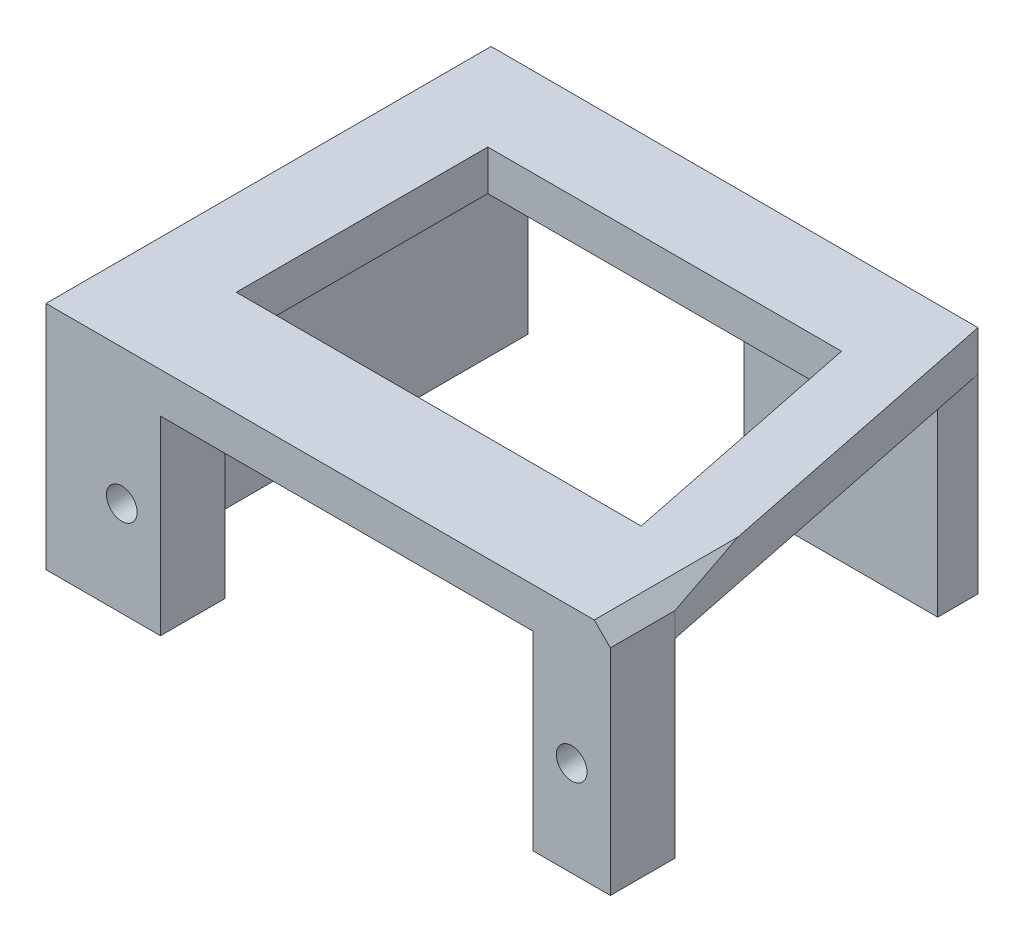
ISO-10303-21;
HEADER;
FILE_DESCRIPTION(('STEP AP214'),'2;1');
FILE_NAME('part.step','',(''),(''),'','','');
FILE_SCHEMA(('AUTOMOTIVE_DESIGN { 1 0 10303 214 1 1 1 1 }'));
ENDSEC;
DATA;
#1=APPLICATION_CONTEXT('core data for automotive mechanical design processes');
#2=APPLICATION_PROTOCOL_DEFINITION('international standard','automotive_design',2000,#1);
#3=PRODUCT_CONTEXT('',#1,'mechanical');
#4=PRODUCT('Part','Part','',(#3));
#5=PRODUCT_RELATED_PRODUCT_CATEGORY('part','',(#4));
#6=PRODUCT_DEFINITION_FORMATION('','',#4);
#7=PRODUCT_DEFINITION_CONTEXT('part definition',#1,'design');
#8=PRODUCT_DEFINITION('design','',#6,#7);
#9=PRODUCT_DEFINITION_SHAPE('','',#8);
#10=(LENGTH_UNIT() NAMED_UNIT(*) SI_UNIT(.MILLI.,.METRE.));
#11=(NAMED_UNIT(*) PLANE_ANGLE_UNIT() SI_UNIT($,.RADIAN.));
#12=(NAMED_UNIT(*) SI_UNIT($,.STERADIAN.) SOLID_ANGLE_UNIT());
#13=UNCERTAINTY_MEASURE_WITH_UNIT(LENGTH_MEASURE(1.E-05),#10,'distance_accuracy_value','');
#14=(GEOMETRIC_REPRESENTATION_CONTEXT(3) GLOBAL_UNCERTAINTY_ASSIGNED_CONTEXT((#13)) GLOBAL_UNIT_ASSIGNED_CONTEXT((#10,
#11,#12)) REPRESENTATION_CONTEXT('',''));
#15=CARTESIAN_POINT('',(0.,0.,0.));
#16=DIRECTION('',(0.,0.,1.));
#17=DIRECTION('',(1.,0.,0.));
#18=AXIS2_PLACEMENT_3D('',#15,#16,#17);
#19=CARTESIAN_POINT('',(0.,0.,0.));
#20=DIRECTION('',(0.,-1.,0.));
#21=DIRECTION('',(0.,0.,-1.));
#22=AXIS2_PLACEMENT_3D('',#19,#20,#21);
#23=PLANE('',#22);
#24=DIRECTION('',(-1.,0.,0.));
#25=VECTOR('',#24,1.);
#26=CARTESIAN_POINT('',(-12.2,0.,7.3));
#27=LINE('',#26,#25);
#28=CARTESIAN_POINT('',(12.9096289563416,0.,7.3));
#29=VERTEX_POINT('',#28);
#30=CARTESIAN_POINT('',(-12.2,0.,7.3));
#31=VERTEX_POINT('',#30);
#32=EDGE_CURVE('E193',#29,#31,#27,.T.);
#33=ORIENTED_EDGE('',*,*,#32,.F.);
#34=DIRECTION('',(0.199309151648976,0.,0.979936662274132));
#35=VECTOR('',#34,1.);
#36=CARTESIAN_POINT('',(12.9096289563416,0.,7.3));
#37=LINE('',#36,#35);
#38=CARTESIAN_POINT('',(9.73674760040939,0.,-8.30000000000001));
#39=VERTEX_POINT('',#38);
#40=EDGE_CURVE('E197',#39,#29,#37,.T.);
#41=ORIENTED_EDGE('',*,*,#40,.F.);
#42=DIRECTION('',(1.,0.,0.));
#43=VECTOR('',#42,1.);
#44=CARTESIAN_POINT('',(9.73674760040939,0.,-8.30000000000001));
#45=LINE('',#44,#43);
#46=CARTESIAN_POINT('',(-12.2,0.,-8.30000000000001));
#47=VERTEX_POINT('',#46);
#48=EDGE_CURVE('E177',#47,#39,#45,.T.);
#49=ORIENTED_EDGE('',*,*,#48,.F.);
#50=DIRECTION('',(0.,0.,-1.));
#51=VECTOR('',#50,1.);
#52=CARTESIAN_POINT('',(-12.2,0.,-8.30000000000001));
#53=LINE('',#52,#51);
#54=EDGE_CURVE('E188',#31,#47,#53,.T.);
#55=ORIENTED_EDGE('',*,*,#54,.F.);
#56=EDGE_LOOP('',(#33,#41,#49,#55));
#57=FACE_BOUND('',#56,.T.);
#58=DIRECTION('',(-0.199309151648976,0.,-0.979936662274132));
#59=VECTOR('',#58,1.);
#60=CARTESIAN_POINT('',(12.7,0.,-13.8));
#61=LINE('',#60,#59);
#62=CARTESIAN_POINT('',(17.5,0.,9.8));
#63=VERTEX_POINT('',#62);
#64=CARTESIAN_POINT('',(12.7,0.,-13.8));
#65=VERTEX_POINT('',#64);
#66=EDGE_CURVE('E204',#63,#65,#61,.T.);
#67=ORIENTED_EDGE('',*,*,#66,.F.);
#68=DIRECTION('',(1.,0.,0.));
#69=VECTOR('',#68,1.);
#70=CARTESIAN_POINT('',(12.7,0.,9.8));
#71=LINE('',#70,#69);
#72=CARTESIAN_POINT('',(12.7,0.,9.8));
#73=VERTEX_POINT('',#72);
#74=EDGE_CURVE('E265',#73,#63,#71,.T.);
#75=ORIENTED_EDGE('',*,*,#74,.F.);
#76=DIRECTION('',(0.,0.,-1.));
#77=VECTOR('',#76,1.);
#78=CARTESIAN_POINT('',(12.7,0.,9.8));
#79=LINE('',#78,#77);
#80=CARTESIAN_POINT('',(12.7,0.,13.8));
#81=VERTEX_POINT('',#80);
#82=EDGE_CURVE('E260',#81,#73,#79,.T.);
#83=ORIENTED_EDGE('',*,*,#82,.F.);
#84=DIRECTION('',(1.,0.,0.));
#85=VECTOR('',#84,1.);
#86=CARTESIAN_POINT('',(-17.5,0.,13.8));
#87=LINE('',#86,#85);
#88=CARTESIAN_POINT('',(-10.4,0.,13.8));
#89=VERTEX_POINT('',#88);
#90=EDGE_CURVE('E317',#89,#81,#87,.T.);
#91=ORIENTED_EDGE('',*,*,#90,.F.);
#92=DIRECTION('',(0.,0.,1.));
#93=VECTOR('',#92,1.);
#94=CARTESIAN_POINT('',(-10.4,0.,13.8));
#95=LINE('',#94,#93);
#96=CARTESIAN_POINT('',(-10.4,0.,9.8));
#97=VERTEX_POINT('',#96);
#98=EDGE_CURVE('E233',#97,#89,#95,.T.);
#99=ORIENTED_EDGE('',*,*,#98,.F.);
#100=DIRECTION('',(1.,0.,0.));
#101=VECTOR('',#100,1.);
#102=CARTESIAN_POINT('',(-15.2,0.,9.8));
#103=LINE('',#102,#101);
#104=CARTESIAN_POINT('',(-15.2,0.,9.8));
#105=VERTEX_POINT('',#104);
#106=EDGE_CURVE('E247',#105,#97,#103,.T.);
#107=ORIENTED_EDGE('',*,*,#106,.F.);
#108=DIRECTION('',(0.,0.,1.));
#109=VECTOR('',#108,1.);
#110=CARTESIAN_POINT('',(-15.2,0.,9.8));
#111=LINE('',#110,#109);
#112=CARTESIAN_POINT('',(-15.2,0.,-13.8));
#113=VERTEX_POINT('',#112);
#114=EDGE_CURVE('E245',#113,#105,#111,.T.);
#115=ORIENTED_EDGE('',*,*,#114,.F.);
#116=DIRECTION('',(-1.,0.,0.));
#117=VECTOR('',#116,1.);
#118=CARTESIAN_POINT('',(-17.5,0.,-13.8));
#119=LINE('',#118,#117);
#120=CARTESIAN_POINT('',(0.700000000000003,0.,-13.8));
#121=VERTEX_POINT('',#120);
#122=EDGE_CURVE('E313',#121,#113,#119,.T.);
#123=ORIENTED_EDGE('',*,*,#122,.F.);
#124=DIRECTION('',(0.,0.,-1.));
#125=VECTOR('',#124,1.);
#126=CARTESIAN_POINT('',(0.700000000000003,0.,-11.3));
#127=LINE('',#126,#125);
#128=CARTESIAN_POINT('',(0.700000000000003,0.,-11.3));
#129=VERTEX_POINT('',#128);
#130=EDGE_CURVE('E288',#129,#121,#127,.T.);
#131=ORIENTED_EDGE('',*,*,#130,.F.);
#132=DIRECTION('',(-1.,0.,0.));
#133=VECTOR('',#132,1.);
#134=CARTESIAN_POINT('',(0.700000000000003,0.,-11.3));
#135=LINE('',#134,#133);
#136=CARTESIAN_POINT('',(12.7,0.,-11.3));
#137=VERTEX_POINT('',#136);
#138=EDGE_CURVE('E297',#137,#129,#135,.T.);
#139=ORIENTED_EDGE('',*,*,#138,.F.);
#140=DIRECTION('',(0.,0.,1.));
#141=VECTOR('',#140,1.);
#142=CARTESIAN_POINT('',(12.7,0.,-11.3));
#143=LINE('',#142,#141);
#144=EDGE_CURVE('E283',#65,#137,#143,.T.);
#145=ORIENTED_EDGE('',*,*,#144,.F.);
#146=EDGE_LOOP('',(#67,#75,#83,#91,#99,#107,#115,#123,#131,#139,#145));
#147=FACE_BOUND('',#146,.T.);
#148=ADVANCED_FACE('F37',(#57,#147),#23,.T.);
#149=CARTESIAN_POINT('',(17.5,2.5,13.8));
#150=DIRECTION('',(-1.,0.,0.));
#151=DIRECTION('',(0.,0.,1.));
#152=AXIS2_PLACEMENT_3D('',#149,#150,#151);
#153=PLANE('',#152);
#154=DIRECTION('',(0.,-1.,0.));
#155=VECTOR('',#154,1.);
#156=CARTESIAN_POINT('',(17.5,10.,9.8));
#157=LINE('',#156,#155);
#158=CARTESIAN_POINT('',(17.5,1.49999999999999,9.8));
#159=VERTEX_POINT('',#158);
#160=EDGE_CURVE('E208',#159,#63,#157,.T.);
#161=ORIENTED_EDGE('',*,*,#160,.F.);
#162=DIRECTION('',(0.,0.,1.));
#163=VECTOR('',#162,1.);
#164=CARTESIAN_POINT('',(17.5,1.49999999999999,13.8));
#165=LINE('',#164,#163);
#166=CARTESIAN_POINT('',(17.5,1.49999999999999,13.8));
#167=VERTEX_POINT('',#166);
#168=EDGE_CURVE('E45',#159,#167,#165,.T.);
#169=ORIENTED_EDGE('',*,*,#168,.T.);
#170=DIRECTION('',(0.,-1.,0.));
#171=VECTOR('',#170,1.);
#172=CARTESIAN_POINT('',(17.5,2.5,13.8));
#173=LINE('',#172,#171);
#174=CARTESIAN_POINT('',(17.5,-11.8,13.8));
#175=VERTEX_POINT('',#174);
#176=EDGE_CURVE('E322',#167,#175,#173,.T.);
#177=ORIENTED_EDGE('',*,*,#176,.T.);
#178=DIRECTION('',(0.,0.,1.));
#179=VECTOR('',#178,1.);
#180=CARTESIAN_POINT('',(17.5,-11.8,9.8));
#181=LINE('',#180,#179);
#182=CARTESIAN_POINT('',(17.5,-11.8,9.8));
#183=VERTEX_POINT('',#182);
#184=EDGE_CURVE('E261',#183,#175,#181,.T.);
#185=ORIENTED_EDGE('',*,*,#184,.F.);
#186=DIRECTION('',(0.,1.,0.));
#187=VECTOR('',#186,1.);
#188=CARTESIAN_POINT('',(17.5,-11.8,9.8));
#189=LINE('',#188,#187);
#190=EDGE_CURVE('E271',#183,#63,#189,.T.);
#191=ORIENTED_EDGE('',*,*,#190,.T.);
#192=EDGE_LOOP('',(#161,#169,#177,#185,#191));
#193=FACE_BOUND('',#192,.T.);
#194=ADVANCED_FACE('F378',(#193),#153,.F.);
#195=CARTESIAN_POINT('',(-17.5,2.5,-13.8));
#196=DIRECTION('',(0.,0.,1.));
#197=DIRECTION('',(1.,0.,0.));
#198=AXIS2_PLACEMENT_3D('',#195,#196,#197);
#199=PLANE('',#198);
#200=CARTESIAN_POINT('',(6.7,-6.,-13.8));
#201=DIRECTION('',(0.,0.,-1.));
#202=DIRECTION('',(-1.,0.,0.));
#203=AXIS2_PLACEMENT_3D('',#200,#201,#202);
#204=CIRCLE('',#203,0.95);
#205=CARTESIAN_POINT('',(5.75,-6.,-13.8));
#206=VERTEX_POINT('',#205);
#207=EDGE_CURVE('E225',#206,#206,#204,.T.);
#208=ORIENTED_EDGE('',*,*,#207,.F.);
#209=EDGE_LOOP('',(#208));
#210=FACE_BOUND('',#209,.T.);
#211=DIRECTION('',(-1.,0.,0.));
#212=VECTOR('',#211,1.);
#213=CARTESIAN_POINT('',(-17.5,2.5,-13.8));
#214=LINE('',#213,#212);
#215=CARTESIAN_POINT('',(12.7,2.5,-13.8));
#216=VERTEX_POINT('',#215);
#217=CARTESIAN_POINT('',(-17.5,2.5,-13.8));
#218=VERTEX_POINT('',#217);
#219=EDGE_CURVE('E314',#216,#218,#214,.T.);
#220=ORIENTED_EDGE('',*,*,#219,.F.);
#221=DIRECTION('',(0.,-1.,0.));
#222=VECTOR('',#221,1.);
#223=CARTESIAN_POINT('',(12.7,10.,-13.8));
#224=LINE('',#223,#222);
#225=EDGE_CURVE('E209',#216,#65,#224,.T.);
#226=ORIENTED_EDGE('',*,*,#225,.T.);
#227=DIRECTION('',(0.,1.,0.));
#228=VECTOR('',#227,1.);
#229=CARTESIAN_POINT('',(12.7,-11.8,-13.8));
#230=LINE('',#229,#228);
#231=CARTESIAN_POINT('',(12.7,-11.8,-13.8));
#232=VERTEX_POINT('',#231);
#233=EDGE_CURVE('E294',#232,#65,#230,.T.);
#234=ORIENTED_EDGE('',*,*,#233,.F.);
#235=DIRECTION('',(1.,0.,0.));
#236=VECTOR('',#235,1.);
#237=CARTESIAN_POINT('',(0.700000000000003,-11.8,-13.8));
#238=LINE('',#237,#236);
#239=CARTESIAN_POINT('',(0.700000000000003,-11.8,-13.8));
#240=VERTEX_POINT('',#239);
#241=EDGE_CURVE('E292',#240,#232,#238,.T.);
#242=ORIENTED_EDGE('',*,*,#241,.F.);
#243=DIRECTION('',(0.,1.,0.));
#244=VECTOR('',#243,1.);
#245=CARTESIAN_POINT('',(0.700000000000003,-11.8,-13.8));
#246=LINE('',#245,#244);
#247=EDGE_CURVE('E304',#240,#121,#246,.T.);
#248=ORIENTED_EDGE('',*,*,#247,.T.);
#249=ORIENTED_EDGE('',*,*,#122,.T.);
#250=DIRECTION('',(0.,1.,0.));
#251=VECTOR('',#250,1.);
#252=CARTESIAN_POINT('',(-15.2,-11.8,-13.8));
#253=LINE('',#252,#251);
#254=CARTESIAN_POINT('',(-15.2,-11.8,-13.8));
#255=VERTEX_POINT('',#254);
#256=EDGE_CURVE('E258',#255,#113,#253,.T.);
#257=ORIENTED_EDGE('',*,*,#256,.F.);
#258=DIRECTION('',(1.,0.,0.));
#259=VECTOR('',#258,1.);
#260=CARTESIAN_POINT('',(-17.5,-11.8,-13.8));
#261=LINE('',#260,#259);
#262=CARTESIAN_POINT('',(-17.5,-11.8,-13.8));
#263=VERTEX_POINT('',#262);
#264=EDGE_CURVE('E232',#263,#255,#261,.T.);
#265=ORIENTED_EDGE('',*,*,#264,.F.);
#266=DIRECTION('',(0.,-1.,0.));
#267=VECTOR('',#266,1.);
#268=CARTESIAN_POINT('',(-17.5,2.5,-13.8));
#269=LINE('',#268,#267);
#270=EDGE_CURVE('E329',#218,#263,#269,.T.);
#271=ORIENTED_EDGE('',*,*,#270,.F.);
#272=EDGE_LOOP('',(#220,#226,#234,#242,#248,#249,#257,#265,#271));
#273=FACE_BOUND('',#272,.T.);
#274=ADVANCED_FACE('F361',(#210,#273),#199,.F.);
#275=CARTESIAN_POINT('',(-17.5,2.5,13.8));
#276=DIRECTION('',(1.,0.,0.));
#277=DIRECTION('',(0.,0.,-1.));
#278=AXIS2_PLACEMENT_3D('',#275,#276,#277);
#279=PLANE('',#278);
#280=ORIENTED_EDGE('',*,*,#270,.T.);
#281=DIRECTION('',(0.,0.,-1.));
#282=VECTOR('',#281,1.);
#283=CARTESIAN_POINT('',(-17.5,-11.8,13.8));
#284=LINE('',#283,#282);
#285=CARTESIAN_POINT('',(-17.5,-11.8,13.8));
#286=VERTEX_POINT('',#285);
#287=EDGE_CURVE('E229',#286,#263,#284,.T.);
#288=ORIENTED_EDGE('',*,*,#287,.F.);
#289=DIRECTION('',(0.,-1.,0.));
#290=VECTOR('',#289,1.);
#291=CARTESIAN_POINT('',(-17.5,2.5,13.8));
#292=LINE('',#291,#290);
#293=CARTESIAN_POINT('',(-17.5,2.5,13.8));
#294=VERTEX_POINT('',#293);
#295=EDGE_CURVE('E327',#294,#286,#292,.T.);
#296=ORIENTED_EDGE('',*,*,#295,.F.);
#297=DIRECTION('',(0.,0.,1.));
#298=VECTOR('',#297,1.);
#299=CARTESIAN_POINT('',(-17.5,2.5,13.8));
#300=LINE('',#299,#298);
#301=EDGE_CURVE('E316',#218,#294,#300,.T.);
#302=ORIENTED_EDGE('',*,*,#301,.F.);
#303=EDGE_LOOP('',(#280,#288,#296,#302));
#304=FACE_BOUND('',#303,.T.);
#305=ADVANCED_FACE('F367',(#304),#279,.F.);
#306=CARTESIAN_POINT('',(-17.5,2.5,13.8));
#307=DIRECTION('',(0.,0.,-1.));
#308=DIRECTION('',(-1.,0.,0.));
#309=AXIS2_PLACEMENT_3D('',#306,#307,#308);
#310=PLANE('',#309);
#311=CARTESIAN_POINT('',(15.1,-5.9,13.8));
#312=DIRECTION('',(0.,0.,-1.));
#313=DIRECTION('',(-1.,0.,0.));
#314=AXIS2_PLACEMENT_3D('',#311,#312,#313);
#315=CIRCLE('',#314,0.949999999999999);
#316=CARTESIAN_POINT('',(14.15,-5.9,13.8));
#317=VERTEX_POINT('',#316);
#318=EDGE_CURVE('E222',#317,#317,#315,.T.);
#319=ORIENTED_EDGE('',*,*,#318,.T.);
#320=EDGE_LOOP('',(#319));
#321=FACE_BOUND('',#320,.T.);
#322=CARTESIAN_POINT('',(-12.8,-5.9,13.8));
#323=DIRECTION('',(0.,0.,-1.));
#324=DIRECTION('',(-1.,0.,0.));
#325=AXIS2_PLACEMENT_3D('',#322,#323,#324);
#326=CIRCLE('',#325,0.949999999999999);
#327=CARTESIAN_POINT('',(-13.75,-5.9,13.8));
#328=VERTEX_POINT('',#327);
#329=EDGE_CURVE('E217',#328,#328,#326,.T.);
#330=ORIENTED_EDGE('',*,*,#329,.T.);
#331=EDGE_LOOP('',(#330));
#332=FACE_BOUND('',#331,.T.);
#333=ORIENTED_EDGE('',*,*,#176,.F.);
#334=DIRECTION('',(0.707106781186545,-0.70710678118655,0.));
#335=VECTOR('',#334,1.);
#336=CARTESIAN_POINT('',(16.5,2.5,13.8));
#337=LINE('',#336,#335);
#338=CARTESIAN_POINT('',(16.5,2.5,13.8));
#339=VERTEX_POINT('',#338);
#340=EDGE_CURVE('E11',#167,#339,#337,.F.);
#341=ORIENTED_EDGE('',*,*,#340,.T.);
#342=DIRECTION('',(1.,0.,0.));
#343=VECTOR('',#342,1.);
#344=CARTESIAN_POINT('',(-17.5,2.5,13.8));
#345=LINE('',#344,#343);
#346=EDGE_CURVE('E319',#294,#339,#345,.T.);
#347=ORIENTED_EDGE('',*,*,#346,.F.);
#348=ORIENTED_EDGE('',*,*,#295,.T.);
#349=DIRECTION('',(-1.,0.,0.));
#350=VECTOR('',#349,1.);
#351=CARTESIAN_POINT('',(-15.2,-11.8,13.8));
#352=LINE('',#351,#350);
#353=CARTESIAN_POINT('',(-10.4,-11.8,13.8));
#354=VERTEX_POINT('',#353);
#355=EDGE_CURVE('E241',#354,#286,#352,.T.);
#356=ORIENTED_EDGE('',*,*,#355,.F.);
#357=DIRECTION('',(0.,1.,0.));
#358=VECTOR('',#357,1.);
#359=CARTESIAN_POINT('',(-10.4,-11.8,13.8));
#360=LINE('',#359,#358);
#361=EDGE_CURVE('E244',#354,#89,#360,.T.);
#362=ORIENTED_EDGE('',*,*,#361,.T.);
#363=ORIENTED_EDGE('',*,*,#90,.T.);
#364=DIRECTION('',(0.,1.,0.));
#365=VECTOR('',#364,1.);
#366=CARTESIAN_POINT('',(12.7,-11.8,13.8));
#367=LINE('',#366,#365);
#368=CARTESIAN_POINT('',(12.7,-11.8,13.8));
#369=VERTEX_POINT('',#368);
#370=EDGE_CURVE('E280',#369,#81,#367,.T.);
#371=ORIENTED_EDGE('',*,*,#370,.F.);
#372=DIRECTION('',(-1.,0.,0.));
#373=VECTOR('',#372,1.);
#374=CARTESIAN_POINT('',(12.7,-11.8,13.8));
#375=LINE('',#374,#373);
#376=EDGE_CURVE('E264',#175,#369,#375,.T.);
#377=ORIENTED_EDGE('',*,*,#376,.F.);
#378=EDGE_LOOP('',(#333,#341,#347,#348,#356,#362,#363,#371,#377));
#379=FACE_BOUND('',#378,.T.);
#380=ADVANCED_FACE('F370',(#321,#332,#379),#310,.F.);
#381=CARTESIAN_POINT('',(0.,2.5,0.));
#382=DIRECTION('',(0.,-1.,0.));
#383=DIRECTION('',(0.,0.,-1.));
#384=AXIS2_PLACEMENT_3D('',#381,#382,#383);
#385=PLANE('',#384);
#386=DIRECTION('',(0.199309151648976,0.,0.979936662274132));
#387=VECTOR('',#386,1.);
#388=CARTESIAN_POINT('',(10.9710395578,2.5,-2.23139787616271));
#389=LINE('',#388,#387);
#390=CARTESIAN_POINT('',(9.73674760040939,2.5,-8.30000000000001));
#391=VERTEX_POINT('',#390);
#392=CARTESIAN_POINT('',(12.9096289563416,2.5,7.3));
#393=VERTEX_POINT('',#392);
#394=EDGE_CURVE('E338',#391,#393,#389,.T.);
#395=ORIENTED_EDGE('',*,*,#394,.T.);
#396=DIRECTION('',(-1.,0.,0.));
#397=VECTOR('',#396,1.);
#398=CARTESIAN_POINT('',(0.,2.5,7.3));
#399=LINE('',#398,#397);
#400=CARTESIAN_POINT('',(-12.2,2.5,7.3));
#401=VERTEX_POINT('',#400);
#402=EDGE_CURVE('E341',#393,#401,#399,.T.);
#403=ORIENTED_EDGE('',*,*,#402,.T.);
#404=DIRECTION('',(0.,0.,-1.));
#405=VECTOR('',#404,1.);
#406=CARTESIAN_POINT('',(-12.2,2.5,0.));
#407=LINE('',#406,#405);
#408=CARTESIAN_POINT('',(-12.2,2.5,-8.30000000000001));
#409=VERTEX_POINT('',#408);
#410=EDGE_CURVE('E335',#401,#409,#407,.T.);
#411=ORIENTED_EDGE('',*,*,#410,.T.);
#412=DIRECTION('',(1.,0.,0.));
#413=VECTOR('',#412,1.);
#414=CARTESIAN_POINT('',(0.,2.5,-8.30000000000001));
#415=LINE('',#414,#413);
#416=EDGE_CURVE('E180',#409,#391,#415,.T.);
#417=ORIENTED_EDGE('',*,*,#416,.T.);
#418=EDGE_LOOP('',(#395,#403,#411,#417));
#419=FACE_BOUND('',#418,.T.);
#420=ORIENTED_EDGE('',*,*,#346,.T.);
#421=DIRECTION('',(0.,0.,-1.));
#422=VECTOR('',#421,1.);
#423=CARTESIAN_POINT('',(16.5,2.5,0.));
#424=LINE('',#423,#422);
#425=CARTESIAN_POINT('',(16.5,2.5,4.88333333333329));
#426=VERTEX_POINT('',#425);
#427=EDGE_CURVE('E344',#339,#426,#424,.T.);
#428=ORIENTED_EDGE('',*,*,#427,.T.);
#429=DIRECTION('',(-0.199309151648976,0.,-0.979936662274132));
#430=VECTOR('',#429,1.);
#431=CARTESIAN_POINT('',(14.8907862068966,2.5,-3.02863448275862));
#432=LINE('',#431,#430);
#433=EDGE_CURVE('E331',#426,#216,#432,.T.);
#434=ORIENTED_EDGE('',*,*,#433,.T.);
#435=ORIENTED_EDGE('',*,*,#219,.T.);
#436=ORIENTED_EDGE('',*,*,#301,.T.);
#437=EDGE_LOOP('',(#420,#428,#434,#435,#436));
#438=FACE_BOUND('',#437,.T.);
#439=ADVANCED_FACE('F349',(#419,#438),#385,.F.);
#440=CARTESIAN_POINT('',(12.7,-11.8,-11.3));
#441=DIRECTION('',(-1.,0.,0.));
#442=DIRECTION('',(0.,0.,1.));
#443=AXIS2_PLACEMENT_3D('',#440,#441,#442);
#444=PLANE('',#443);
#445=ORIENTED_EDGE('',*,*,#144,.T.);
#446=DIRECTION('',(0.,1.,0.));
#447=VECTOR('',#446,1.);
#448=CARTESIAN_POINT('',(12.7,-11.8,-11.3));
#449=LINE('',#448,#447);
#450=CARTESIAN_POINT('',(12.7,-11.8,-11.3));
#451=VERTEX_POINT('',#450);
#452=EDGE_CURVE('E310',#451,#137,#449,.T.);
#453=ORIENTED_EDGE('',*,*,#452,.F.);
#454=DIRECTION('',(0.,0.,1.));
#455=VECTOR('',#454,1.);
#456=CARTESIAN_POINT('',(12.7,-11.8,-11.3));
#457=LINE('',#456,#455);
#458=EDGE_CURVE('E284',#232,#451,#457,.T.);
#459=ORIENTED_EDGE('',*,*,#458,.F.);
#460=ORIENTED_EDGE('',*,*,#233,.T.);
#461=EDGE_LOOP('',(#445,#453,#459,#460));
#462=FACE_BOUND('',#461,.T.);
#463=ADVANCED_FACE('F409',(#462),#444,.F.);
#464=CARTESIAN_POINT('',(0.700000000000003,-11.8,-11.3));
#465=DIRECTION('',(0.,0.,-1.));
#466=DIRECTION('',(-1.,0.,0.));
#467=AXIS2_PLACEMENT_3D('',#464,#465,#466);
#468=PLANE('',#467);
#469=CARTESIAN_POINT('',(6.7,-6.,-11.3));
#470=DIRECTION('',(0.,0.,-1.));
#471=DIRECTION('',(-1.,0.,0.));
#472=AXIS2_PLACEMENT_3D('',#469,#470,#471);
#473=CIRCLE('',#472,0.95);
#474=CARTESIAN_POINT('',(5.75,-6.,-11.3));
#475=VERTEX_POINT('',#474);
#476=EDGE_CURVE('E228',#475,#475,#473,.T.);
#477=ORIENTED_EDGE('',*,*,#476,.T.);
#478=EDGE_LOOP('',(#477));
#479=FACE_BOUND('',#478,.T.);
#480=ORIENTED_EDGE('',*,*,#138,.T.);
#481=DIRECTION('',(0.,1.,0.));
#482=VECTOR('',#481,1.);
#483=CARTESIAN_POINT('',(0.700000000000003,-11.8,-11.3));
#484=LINE('',#483,#482);
#485=CARTESIAN_POINT('',(0.700000000000003,-11.8,-11.3));
#486=VERTEX_POINT('',#485);
#487=EDGE_CURVE('E307',#486,#129,#484,.T.);
#488=ORIENTED_EDGE('',*,*,#487,.F.);
#489=DIRECTION('',(-1.,0.,0.));
#490=VECTOR('',#489,1.);
#491=CARTESIAN_POINT('',(0.700000000000003,-11.8,-11.3));
#492=LINE('',#491,#490);
#493=EDGE_CURVE('E287',#451,#486,#492,.T.);
#494=ORIENTED_EDGE('',*,*,#493,.F.);
#495=ORIENTED_EDGE('',*,*,#452,.T.);
#496=EDGE_LOOP('',(#480,#488,#494,#495));
#497=FACE_BOUND('',#496,.T.);
#498=ADVANCED_FACE('F405',(#479,#497),#468,.F.);
#499=CARTESIAN_POINT('',(0.700000000000003,-11.8,-11.3));
#500=DIRECTION('',(1.,0.,0.));
#501=DIRECTION('',(0.,0.,-1.));
#502=AXIS2_PLACEMENT_3D('',#499,#500,#501);
#503=PLANE('',#502);
#504=ORIENTED_EDGE('',*,*,#130,.T.);
#505=ORIENTED_EDGE('',*,*,#247,.F.);
#506=DIRECTION('',(0.,0.,-1.));
#507=VECTOR('',#506,1.);
#508=CARTESIAN_POINT('',(0.700000000000003,-11.8,-11.3));
#509=LINE('',#508,#507);
#510=EDGE_CURVE('E290',#486,#240,#509,.T.);
#511=ORIENTED_EDGE('',*,*,#510,.F.);
#512=ORIENTED_EDGE('',*,*,#487,.T.);
#513=EDGE_LOOP('',(#504,#505,#511,#512));
#514=FACE_BOUND('',#513,.T.);
#515=ADVANCED_FACE('F408',(#514),#503,.F.);
#516=CARTESIAN_POINT('',(0.,-11.8,0.));
#517=DIRECTION('',(0.,-1.,0.));
#518=DIRECTION('',(0.,0.,-1.));
#519=AXIS2_PLACEMENT_3D('',#516,#517,#518);
#520=PLANE('',#519);
#521=ORIENTED_EDGE('',*,*,#458,.T.);
#522=ORIENTED_EDGE('',*,*,#493,.T.);
#523=ORIENTED_EDGE('',*,*,#510,.T.);
#524=ORIENTED_EDGE('',*,*,#241,.T.);
#525=EDGE_LOOP('',(#521,#522,#523,#524));
#526=FACE_BOUND('',#525,.T.);
#527=ADVANCED_FACE('F418',(#526),#520,.T.);
#528=CARTESIAN_POINT('',(12.7,-11.8,9.8));
#529=DIRECTION('',(1.,0.,0.));
#530=DIRECTION('',(0.,0.,-1.));
#531=AXIS2_PLACEMENT_3D('',#528,#529,#530);
#532=PLANE('',#531);
#533=ORIENTED_EDGE('',*,*,#82,.T.);
#534=DIRECTION('',(0.,1.,0.));
#535=VECTOR('',#534,1.);
#536=CARTESIAN_POINT('',(12.7,-11.8,9.8));
#537=LINE('',#536,#535);
#538=CARTESIAN_POINT('',(12.7,-11.8,9.8));
#539=VERTEX_POINT('',#538);
#540=EDGE_CURVE('E278',#539,#73,#537,.T.);
#541=ORIENTED_EDGE('',*,*,#540,.F.);
#542=DIRECTION('',(0.,0.,-1.));
#543=VECTOR('',#542,1.);
#544=CARTESIAN_POINT('',(12.7,-11.8,9.8));
#545=LINE('',#544,#543);
#546=EDGE_CURVE('E267',#369,#539,#545,.T.);
#547=ORIENTED_EDGE('',*,*,#546,.F.);
#548=ORIENTED_EDGE('',*,*,#370,.T.);
#549=EDGE_LOOP('',(#533,#541,#547,#548));
#550=FACE_BOUND('',#549,.T.);
#551=ADVANCED_FACE('F434',(#550),#532,.F.);
#552=CARTESIAN_POINT('',(12.7,-11.8,9.8));
#553=DIRECTION('',(0.,0.,1.));
#554=DIRECTION('',(1.,0.,0.));
#555=AXIS2_PLACEMENT_3D('',#552,#553,#554);
#556=PLANE('',#555);
#557=CARTESIAN_POINT('',(15.1,-5.9,9.8));
#558=DIRECTION('',(0.,0.,-1.));
#559=DIRECTION('',(-1.,0.,0.));
#560=AXIS2_PLACEMENT_3D('',#557,#558,#559);
#561=CIRCLE('',#560,0.949999999999999);
#562=CARTESIAN_POINT('',(14.15,-5.9,9.8));
#563=VERTEX_POINT('',#562);
#564=EDGE_CURVE('E214',#563,#563,#561,.T.);
#565=ORIENTED_EDGE('',*,*,#564,.F.);
#566=EDGE_LOOP('',(#565));
#567=FACE_BOUND('',#566,.T.);
#568=ORIENTED_EDGE('',*,*,#74,.T.);
#569=ORIENTED_EDGE('',*,*,#190,.F.);
#570=DIRECTION('',(1.,0.,0.));
#571=VECTOR('',#570,1.);
#572=CARTESIAN_POINT('',(12.7,-11.8,9.8));
#573=LINE('',#572,#571);
#574=EDGE_CURVE('E269',#539,#183,#573,.T.);
#575=ORIENTED_EDGE('',*,*,#574,.F.);
#576=ORIENTED_EDGE('',*,*,#540,.T.);
#577=EDGE_LOOP('',(#568,#569,#575,#576));
#578=FACE_BOUND('',#577,.T.);
#579=ADVANCED_FACE('F425',(#567,#578),#556,.F.);
#580=CARTESIAN_POINT('',(0.,-11.8,0.));
#581=DIRECTION('',(0.,1.,0.));
#582=DIRECTION('',(0.,0.,1.));
#583=AXIS2_PLACEMENT_3D('',#580,#581,#582);
#584=PLANE('',#583);
#585=ORIENTED_EDGE('',*,*,#184,.T.);
#586=ORIENTED_EDGE('',*,*,#376,.T.);
#587=ORIENTED_EDGE('',*,*,#546,.T.);
#588=ORIENTED_EDGE('',*,*,#574,.T.);
#589=EDGE_LOOP('',(#585,#586,#587,#588));
#590=FACE_BOUND('',#589,.T.);
#591=ADVANCED_FACE('F430',(#590),#584,.F.);
#592=CARTESIAN_POINT('',(-15.2,-11.8,9.8));
#593=DIRECTION('',(-1.,0.,0.));
#594=DIRECTION('',(0.,0.,1.));
#595=AXIS2_PLACEMENT_3D('',#592,#593,#594);
#596=PLANE('',#595);
#597=ORIENTED_EDGE('',*,*,#114,.T.);
#598=DIRECTION('',(0.,1.,0.));
#599=VECTOR('',#598,1.);
#600=CARTESIAN_POINT('',(-15.2,-11.8,9.8));
#601=LINE('',#600,#599);
#602=CARTESIAN_POINT('',(-15.2,-11.8,9.8));
#603=VERTEX_POINT('',#602);
#604=EDGE_CURVE('E255',#603,#105,#601,.T.);
#605=ORIENTED_EDGE('',*,*,#604,.F.);
#606=DIRECTION('',(0.,0.,1.));
#607=VECTOR('',#606,1.);
#608=CARTESIAN_POINT('',(-15.2,-11.8,9.8));
#609=LINE('',#608,#607);
#610=EDGE_CURVE('E235',#255,#603,#609,.T.);
#611=ORIENTED_EDGE('',*,*,#610,.F.);
#612=ORIENTED_EDGE('',*,*,#256,.T.);
#613=EDGE_LOOP('',(#597,#605,#611,#612));
#614=FACE_BOUND('',#613,.T.);
#615=ADVANCED_FACE('F451',(#614),#596,.F.);
#616=CARTESIAN_POINT('',(-15.2,-11.8,9.8));
#617=DIRECTION('',(0.,0.,1.));
#618=DIRECTION('',(1.,0.,0.));
#619=AXIS2_PLACEMENT_3D('',#616,#617,#618);
#620=PLANE('',#619);
#621=CARTESIAN_POINT('',(-12.8,-5.9,9.8));
#622=DIRECTION('',(0.,0.,-1.));
#623=DIRECTION('',(1.,0.,0.));
#624=AXIS2_PLACEMENT_3D('',#621,#622,#623);
#625=CIRCLE('',#624,0.949999999999999);
#626=CARTESIAN_POINT('',(-11.85,-5.9,9.8));
#627=VERTEX_POINT('',#626);
#628=EDGE_CURVE('E212',#627,#627,#625,.T.);
#629=ORIENTED_EDGE('',*,*,#628,.F.);
#630=EDGE_LOOP('',(#629));
#631=FACE_BOUND('',#630,.T.);
#632=ORIENTED_EDGE('',*,*,#106,.T.);
#633=DIRECTION('',(0.,1.,0.));
#634=VECTOR('',#633,1.);
#635=CARTESIAN_POINT('',(-10.4,-11.8,9.8));
#636=LINE('',#635,#634);
#637=CARTESIAN_POINT('',(-10.4,-11.8,9.8));
#638=VERTEX_POINT('',#637);
#639=EDGE_CURVE('E252',#638,#97,#636,.T.);
#640=ORIENTED_EDGE('',*,*,#639,.F.);
#641=DIRECTION('',(1.,0.,0.));
#642=VECTOR('',#641,1.);
#643=CARTESIAN_POINT('',(-15.2,-11.8,9.8));
#644=LINE('',#643,#642);
#645=EDGE_CURVE('E237',#603,#638,#644,.T.);
#646=ORIENTED_EDGE('',*,*,#645,.F.);
#647=ORIENTED_EDGE('',*,*,#604,.T.);
#648=EDGE_LOOP('',(#632,#640,#646,#647));
#649=FACE_BOUND('',#648,.T.);
#650=ADVANCED_FACE('F445',(#631,#649),#620,.F.);
#651=CARTESIAN_POINT('',(-10.4,-11.8,13.8));
#652=DIRECTION('',(-1.,0.,0.));
#653=DIRECTION('',(0.,0.,1.));
#654=AXIS2_PLACEMENT_3D('',#651,#652,#653);
#655=PLANE('',#654);
#656=ORIENTED_EDGE('',*,*,#98,.T.);
#657=ORIENTED_EDGE('',*,*,#361,.F.);
#658=DIRECTION('',(0.,0.,1.));
#659=VECTOR('',#658,1.);
#660=CARTESIAN_POINT('',(-10.4,-11.8,13.8));
#661=LINE('',#660,#659);
#662=EDGE_CURVE('E239',#638,#354,#661,.T.);
#663=ORIENTED_EDGE('',*,*,#662,.F.);
#664=ORIENTED_EDGE('',*,*,#639,.T.);
#665=EDGE_LOOP('',(#656,#657,#663,#664));
#666=FACE_BOUND('',#665,.T.);
#667=ADVANCED_FACE('F441',(#666),#655,.F.);
#668=CARTESIAN_POINT('',(0.,-11.8,0.));
#669=DIRECTION('',(0.,-1.,0.));
#670=DIRECTION('',(0.,0.,-1.));
#671=AXIS2_PLACEMENT_3D('',#668,#669,#670);
#672=PLANE('',#671);
#673=ORIENTED_EDGE('',*,*,#287,.T.);
#674=ORIENTED_EDGE('',*,*,#264,.T.);
#675=ORIENTED_EDGE('',*,*,#610,.T.);
#676=ORIENTED_EDGE('',*,*,#645,.T.);
#677=ORIENTED_EDGE('',*,*,#662,.T.);
#678=ORIENTED_EDGE('',*,*,#355,.T.);
#679=EDGE_LOOP('',(#673,#674,#675,#676,#677,#678));
#680=FACE_BOUND('',#679,.T.);
#681=ADVANCED_FACE('F401',(#680),#672,.T.);
#682=CARTESIAN_POINT('',(6.7,-6.,-2.));
#683=DIRECTION('',(0.,0.,-1.));
#684=DIRECTION('',(-1.,0.,0.));
#685=AXIS2_PLACEMENT_3D('',#682,#683,#684);
#686=CYLINDRICAL_SURFACE('',#685,0.95);
#687=ORIENTED_EDGE('',*,*,#207,.T.);
#688=EDGE_LOOP('',(#687));
#689=FACE_BOUND('',#688,.T.);
#690=ORIENTED_EDGE('',*,*,#476,.F.);
#691=EDGE_LOOP('',(#690));
#692=FACE_BOUND('',#691,.T.);
#693=ADVANCED_FACE('F397',(#689,#692),#686,.F.);
#694=CARTESIAN_POINT('',(-12.8,-5.9,21.6));
#695=DIRECTION('',(0.,0.,-1.));
#696=DIRECTION('',(-1.,0.,0.));
#697=AXIS2_PLACEMENT_3D('',#694,#695,#696);
#698=CYLINDRICAL_SURFACE('',#697,0.949999999999999);
#699=ORIENTED_EDGE('',*,*,#628,.T.);
#700=EDGE_LOOP('',(#699));
#701=FACE_BOUND('',#700,.T.);
#702=ORIENTED_EDGE('',*,*,#329,.F.);
#703=EDGE_LOOP('',(#702));
#704=FACE_BOUND('',#703,.T.);
#705=ADVANCED_FACE('F400',(#701,#704),#698,.F.);
#706=CARTESIAN_POINT('',(15.1,-5.9,21.6));
#707=DIRECTION('',(0.,0.,-1.));
#708=DIRECTION('',(-1.,0.,0.));
#709=AXIS2_PLACEMENT_3D('',#706,#707,#708);
#710=CYLINDRICAL_SURFACE('',#709,0.949999999999999);
#711=ORIENTED_EDGE('',*,*,#564,.T.);
#712=EDGE_LOOP('',(#711));
#713=FACE_BOUND('',#712,.T.);
#714=ORIENTED_EDGE('',*,*,#318,.F.);
#715=EDGE_LOOP('',(#714));
#716=FACE_BOUND('',#715,.T.);
#717=ADVANCED_FACE('F495',(#713,#716),#710,.F.);
#718=CARTESIAN_POINT('',(12.7,10.,-13.8));
#719=DIRECTION('',(-0.979936662274132,0.,0.199309151648976));
#720=DIRECTION('',(0.199309151648976,0.,0.979936662274132));
#721=AXIS2_PLACEMENT_3D('',#718,#719,#720);
#722=PLANE('',#721);
#723=ORIENTED_EDGE('',*,*,#433,.F.);
#724=DIRECTION('',(-0.195464628005359,0.195464628005361,-0.96103442102635));
#725=VECTOR('',#724,1.);
#726=CARTESIAN_POINT('',(15.5826744494561,3.41732555054391,0.373149376492437));
#727=LINE('',#726,#725);
#728=EDGE_CURVE('E59',#426,#159,#727,.F.);
#729=ORIENTED_EDGE('',*,*,#728,.T.);
#730=ORIENTED_EDGE('',*,*,#160,.T.);
#731=ORIENTED_EDGE('',*,*,#66,.T.);
#732=ORIENTED_EDGE('',*,*,#225,.F.);
#733=EDGE_LOOP('',(#723,#729,#730,#731,#732));
#734=FACE_BOUND('',#733,.T.);
#735=ADVANCED_FACE('F354',(#734),#722,.F.);
#736=CARTESIAN_POINT('',(-12.2,10.,7.3));
#737=DIRECTION('',(0.,0.,1.));
#738=DIRECTION('',(1.,0.,0.));
#739=AXIS2_PLACEMENT_3D('',#736,#737,#738);
#740=PLANE('',#739);
#741=DIRECTION('',(0.,-1.,0.));
#742=VECTOR('',#741,1.);
#743=CARTESIAN_POINT('',(12.9096289563416,10.,7.3));
#744=LINE('',#743,#742);
#745=EDGE_CURVE('E202',#393,#29,#744,.T.);
#746=ORIENTED_EDGE('',*,*,#745,.T.);
#747=ORIENTED_EDGE('',*,*,#32,.T.);
#748=DIRECTION('',(0.,-1.,0.));
#749=VECTOR('',#748,1.);
#750=CARTESIAN_POINT('',(-12.2,10.,7.3));
#751=LINE('',#750,#749);
#752=EDGE_CURVE('E184',#401,#31,#751,.T.);
#753=ORIENTED_EDGE('',*,*,#752,.F.);
#754=ORIENTED_EDGE('',*,*,#402,.F.);
#755=EDGE_LOOP('',(#746,#747,#753,#754));
#756=FACE_BOUND('',#755,.T.);
#757=ADVANCED_FACE('F487',(#756),#740,.F.);
#758=CARTESIAN_POINT('',(12.9096289563416,10.,7.3));
#759=DIRECTION('',(0.979936662274132,0.,-0.199309151648976));
#760=DIRECTION('',(-0.199309151648976,0.,-0.979936662274132));
#761=AXIS2_PLACEMENT_3D('',#758,#759,#760);
#762=PLANE('',#761);
#763=DIRECTION('',(0.,-1.,0.));
#764=VECTOR('',#763,1.);
#765=CARTESIAN_POINT('',(9.73674760040939,10.,-8.30000000000001));
#766=LINE('',#765,#764);
#767=EDGE_CURVE('E183',#391,#39,#766,.T.);
#768=ORIENTED_EDGE('',*,*,#767,.T.);
#769=ORIENTED_EDGE('',*,*,#40,.T.);
#770=ORIENTED_EDGE('',*,*,#745,.F.);
#771=ORIENTED_EDGE('',*,*,#394,.F.);
#772=EDGE_LOOP('',(#768,#769,#770,#771));
#773=FACE_BOUND('',#772,.T.);
#774=ADVANCED_FACE('F485',(#773),#762,.F.);
#775=CARTESIAN_POINT('',(9.73674760040939,10.,-8.30000000000001));
#776=DIRECTION('',(0.,0.,-1.));
#777=DIRECTION('',(-1.,0.,0.));
#778=AXIS2_PLACEMENT_3D('',#775,#776,#777);
#779=PLANE('',#778);
#780=DIRECTION('',(0.,-1.,0.));
#781=VECTOR('',#780,1.);
#782=CARTESIAN_POINT('',(-12.2,10.,-8.30000000000001));
#783=LINE('',#782,#781);
#784=EDGE_CURVE('E172',#409,#47,#783,.T.);
#785=ORIENTED_EDGE('',*,*,#784,.T.);
#786=ORIENTED_EDGE('',*,*,#48,.T.);
#787=ORIENTED_EDGE('',*,*,#767,.F.);
#788=ORIENTED_EDGE('',*,*,#416,.F.);
#789=EDGE_LOOP('',(#785,#786,#787,#788));
#790=FACE_BOUND('',#789,.T.);
#791=ADVANCED_FACE('F174',(#790),#779,.F.);
#792=CARTESIAN_POINT('',(-12.2,10.,-8.30000000000001));
#793=DIRECTION('',(-1.,0.,0.));
#794=DIRECTION('',(0.,0.,1.));
#795=AXIS2_PLACEMENT_3D('',#792,#793,#794);
#796=PLANE('',#795);
#797=ORIENTED_EDGE('',*,*,#752,.T.);
#798=ORIENTED_EDGE('',*,*,#54,.T.);
#799=ORIENTED_EDGE('',*,*,#784,.F.);
#800=ORIENTED_EDGE('',*,*,#410,.F.);
#801=EDGE_LOOP('',(#797,#798,#799,#800));
#802=FACE_BOUND('',#801,.T.);
#803=ADVANCED_FACE('F189',(#802),#796,.F.);
#804=CARTESIAN_POINT('',(16.5,2.5,0.));
#805=DIRECTION('',(-0.70710678118655,-0.707106781186545,0.));
#806=DIRECTION('',(0.,0.,-1.));
#807=AXIS2_PLACEMENT_3D('',#804,#805,#806);
#808=PLANE('',#807);
#809=ORIENTED_EDGE('',*,*,#340,.F.);
#810=ORIENTED_EDGE('',*,*,#168,.F.);
#811=ORIENTED_EDGE('',*,*,#728,.F.);
#812=ORIENTED_EDGE('',*,*,#427,.F.);
#813=EDGE_LOOP('',(#809,#810,#811,#812));
#814=FACE_BOUND('',#813,.T.);
#815=ADVANCED_FACE('F39',(#814),#808,.F.);
#816=CLOSED_SHELL('',(#148,#194,#274,#305,#380,#439,#463,#498,#515,#527,#551,#579,#591,#615,
#650,#667,#681,#693,#705,#717,#735,#757,#774,#791,#803,#815));
#817=MANIFOLD_SOLID_BREP('B2',#816);
#818=ADVANCED_BREP_SHAPE_REPRESENTATION('',(#18,#817),#14);
#819=SHAPE_DEFINITION_REPRESENTATION(#9,#818);
ENDSEC;
END-ISO-10303-21;
